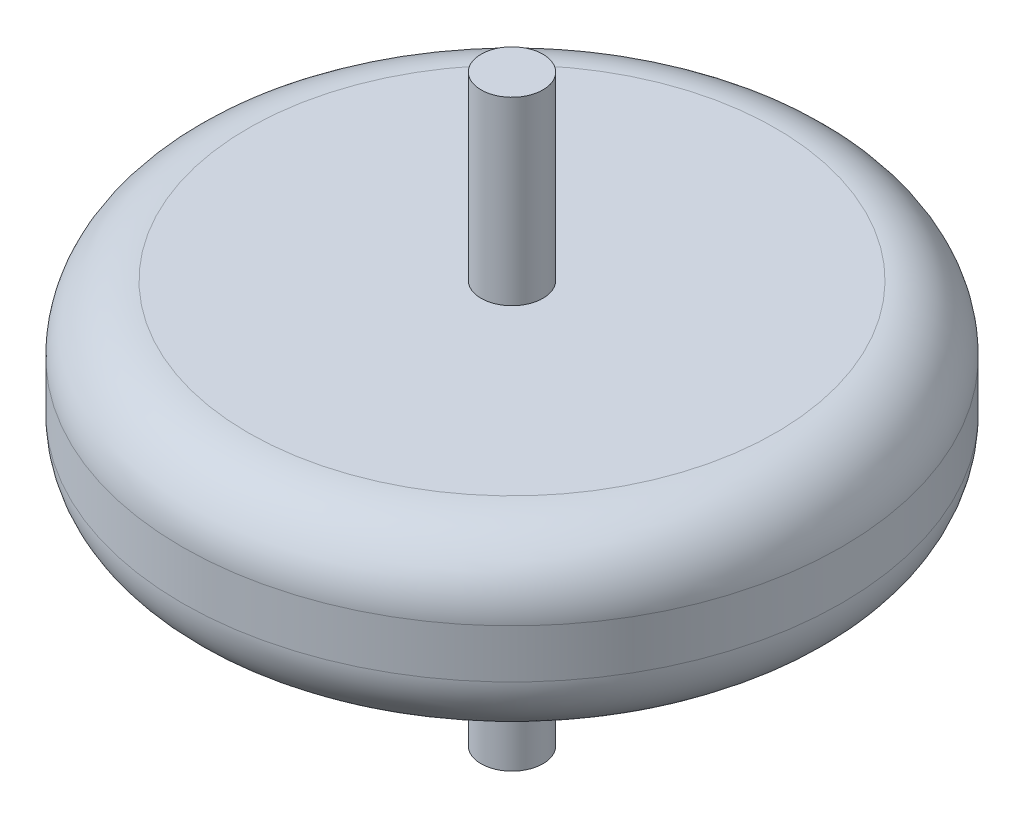
ISO-10303-21;
HEADER;
FILE_DESCRIPTION(('STEP AP214'),'2;1');
FILE_NAME('part.step','',(''),(''),'','','');
FILE_SCHEMA(('AUTOMOTIVE_DESIGN { 1 0 10303 214 1 1 1 1 }'));
ENDSEC;
DATA;
#1=APPLICATION_CONTEXT('core data for automotive mechanical design processes');
#2=APPLICATION_PROTOCOL_DEFINITION('international standard','automotive_design',2000,#1);
#3=PRODUCT_CONTEXT('',#1,'mechanical');
#4=PRODUCT('Part','Part','',(#3));
#5=PRODUCT_RELATED_PRODUCT_CATEGORY('part','',(#4));
#6=PRODUCT_DEFINITION_FORMATION('','',#4);
#7=PRODUCT_DEFINITION_CONTEXT('part definition',#1,'design');
#8=PRODUCT_DEFINITION('design','',#6,#7);
#9=PRODUCT_DEFINITION_SHAPE('','',#8);
#10=(LENGTH_UNIT() NAMED_UNIT(*) SI_UNIT(.MILLI.,.METRE.));
#11=(NAMED_UNIT(*) PLANE_ANGLE_UNIT() SI_UNIT($,.RADIAN.));
#12=(NAMED_UNIT(*) SI_UNIT($,.STERADIAN.) SOLID_ANGLE_UNIT());
#13=UNCERTAINTY_MEASURE_WITH_UNIT(LENGTH_MEASURE(1.E-05),#10,'distance_accuracy_value','');
#14=(GEOMETRIC_REPRESENTATION_CONTEXT(3) GLOBAL_UNCERTAINTY_ASSIGNED_CONTEXT((#13)) GLOBAL_UNIT_ASSIGNED_CONTEXT((#10,
#11,#12)) REPRESENTATION_CONTEXT('',''));
#15=CARTESIAN_POINT('',(0.,0.,0.));
#16=DIRECTION('',(0.,0.,1.));
#17=DIRECTION('',(1.,0.,0.));
#18=AXIS2_PLACEMENT_3D('',#15,#16,#17);
#19=CARTESIAN_POINT('',(0.,27.813,0.));
#20=DIRECTION('',(0.,-1.,0.));
#21=DIRECTION('',(0.,0.,-1.));
#22=AXIS2_PLACEMENT_3D('',#19,#20,#21);
#23=CYLINDRICAL_SURFACE('',#22,101.6);
#24=CARTESIAN_POINT('',(0.,-7.49300000000001,0.));
#25=DIRECTION('',(0.,1.,0.));
#26=DIRECTION('',(0.,0.,1.));
#27=AXIS2_PLACEMENT_3D('',#24,#25,#26);
#28=CIRCLE('',#27,101.6);
#29=CARTESIAN_POINT('',(0.,-7.49300000000001,101.6));
#30=VERTEX_POINT('',#29);
#31=EDGE_CURVE('E48',#30,#30,#28,.T.);
#32=ORIENTED_EDGE('',*,*,#31,.T.);
#33=EDGE_LOOP('',(#32));
#34=FACE_BOUND('',#33,.T.);
#35=CARTESIAN_POINT('',(0.,7.49300000000001,0.));
#36=DIRECTION('',(0.,1.,0.));
#37=DIRECTION('',(0.,0.,1.));
#38=AXIS2_PLACEMENT_3D('',#35,#36,#37);
#39=CIRCLE('',#38,101.6);
#40=CARTESIAN_POINT('',(0.,7.49300000000001,101.6));
#41=VERTEX_POINT('',#40);
#42=EDGE_CURVE('E52',#41,#41,#39,.F.);
#43=ORIENTED_EDGE('',*,*,#42,.T.);
#44=EDGE_LOOP('',(#43));
#45=FACE_BOUND('',#44,.T.);
#46=ADVANCED_FACE('F37',(#34,#45),#23,.T.);
#47=CARTESIAN_POINT('',(0.,27.813,0.));
#48=DIRECTION('',(0.,1.,0.));
#49=DIRECTION('',(0.,0.,1.));
#50=AXIS2_PLACEMENT_3D('',#47,#48,#49);
#51=PLANE('',#50);
#52=CARTESIAN_POINT('',(0.,27.813,0.));
#53=DIRECTION('',(0.,1.,0.));
#54=DIRECTION('',(0.,0.,1.));
#55=AXIS2_PLACEMENT_3D('',#52,#53,#54);
#56=CIRCLE('',#55,81.28);
#57=CARTESIAN_POINT('',(0.,27.813,81.28));
#58=VERTEX_POINT('',#57);
#59=EDGE_CURVE('E10',#58,#58,#56,.T.);
#60=ORIENTED_EDGE('',*,*,#59,.T.);
#61=EDGE_LOOP('',(#60));
#62=FACE_BOUND('',#61,.T.);
#63=CARTESIAN_POINT('',(0.,27.813,0.));
#64=DIRECTION('',(0.,1.,0.));
#65=DIRECTION('',(0.,0.,1.));
#66=AXIS2_PLACEMENT_3D('',#63,#64,#65);
#67=CIRCLE('',#66,9.525);
#68=CARTESIAN_POINT('',(0.,27.813,9.525));
#69=VERTEX_POINT('',#68);
#70=EDGE_CURVE('E57',#69,#69,#67,.T.);
#71=ORIENTED_EDGE('',*,*,#70,.F.);
#72=EDGE_LOOP('',(#71));
#73=FACE_BOUND('',#72,.T.);
#74=ADVANCED_FACE('F88',(#62,#73),#51,.T.);
#75=CARTESIAN_POINT('',(0.,-27.813,0.));
#76=DIRECTION('',(0.,1.,0.));
#77=DIRECTION('',(0.,0.,1.));
#78=AXIS2_PLACEMENT_3D('',#75,#76,#77);
#79=PLANE('',#78);
#80=CARTESIAN_POINT('',(0.,-27.813,0.));
#81=DIRECTION('',(0.,1.,0.));
#82=DIRECTION('',(0.,0.,1.));
#83=AXIS2_PLACEMENT_3D('',#80,#81,#82);
#84=CIRCLE('',#83,81.28);
#85=CARTESIAN_POINT('',(0.,-27.813,81.28));
#86=VERTEX_POINT('',#85);
#87=EDGE_CURVE('E44',#86,#86,#84,.F.);
#88=ORIENTED_EDGE('',*,*,#87,.T.);
#89=EDGE_LOOP('',(#88));
#90=FACE_BOUND('',#89,.T.);
#91=CARTESIAN_POINT('',(0.,-27.813,0.));
#92=DIRECTION('',(0.,1.,0.));
#93=DIRECTION('',(0.,0.,1.));
#94=AXIS2_PLACEMENT_3D('',#91,#92,#93);
#95=CIRCLE('',#94,9.525);
#96=CARTESIAN_POINT('',(0.,-27.813,9.525));
#97=VERTEX_POINT('',#96);
#98=EDGE_CURVE('E58',#97,#97,#95,.T.);
#99=ORIENTED_EDGE('',*,*,#98,.T.);
#100=EDGE_LOOP('',(#99));
#101=FACE_BOUND('',#100,.T.);
#102=ADVANCED_FACE('F94',(#90,#101),#79,.F.);
#103=CARTESIAN_POINT('',(0.,-96.3929999999999,0.));
#104=DIRECTION('',(0.,1.,0.));
#105=DIRECTION('',(0.,0.,1.));
#106=AXIS2_PLACEMENT_3D('',#103,#104,#105);
#107=PLANE('',#106);
#108=CARTESIAN_POINT('',(0.,-96.3929999999999,0.));
#109=DIRECTION('',(0.,1.,0.));
#110=DIRECTION('',(0.,0.,1.));
#111=AXIS2_PLACEMENT_3D('',#108,#109,#110);
#112=CIRCLE('',#111,9.525);
#113=CARTESIAN_POINT('',(0.,-96.3929999999999,9.525));
#114=VERTEX_POINT('',#113);
#115=EDGE_CURVE('E61',#114,#114,#112,.T.);
#116=ORIENTED_EDGE('',*,*,#115,.F.);
#117=EDGE_LOOP('',(#116));
#118=FACE_BOUND('',#117,.T.);
#119=ADVANCED_FACE('F83',(#118),#107,.F.);
#120=CARTESIAN_POINT('',(0.,-96.3929999999999,0.));
#121=DIRECTION('',(0.,1.,0.));
#122=DIRECTION('',(0.,0.,1.));
#123=AXIS2_PLACEMENT_3D('',#120,#121,#122);
#124=CYLINDRICAL_SURFACE('',#123,9.525);
#125=ORIENTED_EDGE('',*,*,#115,.T.);
#126=EDGE_LOOP('',(#125));
#127=FACE_BOUND('',#126,.T.);
#128=ORIENTED_EDGE('',*,*,#98,.F.);
#129=EDGE_LOOP('',(#128));
#130=FACE_BOUND('',#129,.T.);
#131=ADVANCED_FACE('F74',(#127,#130),#124,.T.);
#132=ORIENTED_EDGE('',*,*,#70,.T.);
#133=EDGE_LOOP('',(#132));
#134=FACE_BOUND('',#133,.T.);
#135=CARTESIAN_POINT('',(0.,83.439,0.));
#136=DIRECTION('',(0.,1.,0.));
#137=DIRECTION('',(0.,0.,1.));
#138=AXIS2_PLACEMENT_3D('',#135,#136,#137);
#139=CIRCLE('',#138,9.525);
#140=CARTESIAN_POINT('',(0.,83.439,9.525));
#141=VERTEX_POINT('',#140);
#142=EDGE_CURVE('E66',#141,#141,#139,.T.);
#143=ORIENTED_EDGE('',*,*,#142,.F.);
#144=EDGE_LOOP('',(#143));
#145=FACE_BOUND('',#144,.T.);
#146=ADVANCED_FACE('F72',(#134,#145),#124,.T.);
#147=CARTESIAN_POINT('',(0.,83.439,0.));
#148=DIRECTION('',(0.,1.,0.));
#149=DIRECTION('',(0.,0.,1.));
#150=AXIS2_PLACEMENT_3D('',#147,#148,#149);
#151=PLANE('',#150);
#152=ORIENTED_EDGE('',*,*,#142,.T.);
#153=EDGE_LOOP('',(#152));
#154=FACE_BOUND('',#153,.T.);
#155=ADVANCED_FACE('F70',(#154),#151,.T.);
#156=CARTESIAN_POINT('',(0.,-7.49300000000001,0.));
#157=DIRECTION('',(0.,1.,0.));
#158=DIRECTION('',(0.,0.,1.));
#159=AXIS2_PLACEMENT_3D('',#156,#157,#158);
#160=TOROIDAL_SURFACE('',#159,81.28,20.32);
#161=ORIENTED_EDGE('',*,*,#87,.F.);
#162=EDGE_LOOP('',(#161));
#163=FACE_BOUND('',#162,.T.);
#164=ORIENTED_EDGE('',*,*,#31,.F.);
#165=EDGE_LOOP('',(#164));
#166=FACE_BOUND('',#165,.T.);
#167=ADVANCED_FACE('F81',(#163,#166),#160,.T.);
#168=CARTESIAN_POINT('',(0.,7.49300000000001,0.));
#169=DIRECTION('',(0.,1.,0.));
#170=DIRECTION('',(0.,0.,1.));
#171=AXIS2_PLACEMENT_3D('',#168,#169,#170);
#172=TOROIDAL_SURFACE('',#171,81.28,20.32);
#173=ORIENTED_EDGE('',*,*,#42,.F.);
#174=EDGE_LOOP('',(#173));
#175=FACE_BOUND('',#174,.T.);
#176=ORIENTED_EDGE('',*,*,#59,.F.);
#177=EDGE_LOOP('',(#176));
#178=FACE_BOUND('',#177,.T.);
#179=ADVANCED_FACE('F39',(#175,#178),#172,.T.);
#180=CLOSED_SHELL('',(#46,#74,#102,#119,#131,#146,#155,#167,#179));
#181=MANIFOLD_SOLID_BREP('B2',#180);
#182=ADVANCED_BREP_SHAPE_REPRESENTATION('',(#18,#181),#14);
#183=SHAPE_DEFINITION_REPRESENTATION(#9,#182);
ENDSEC;
END-ISO-10303-21;
